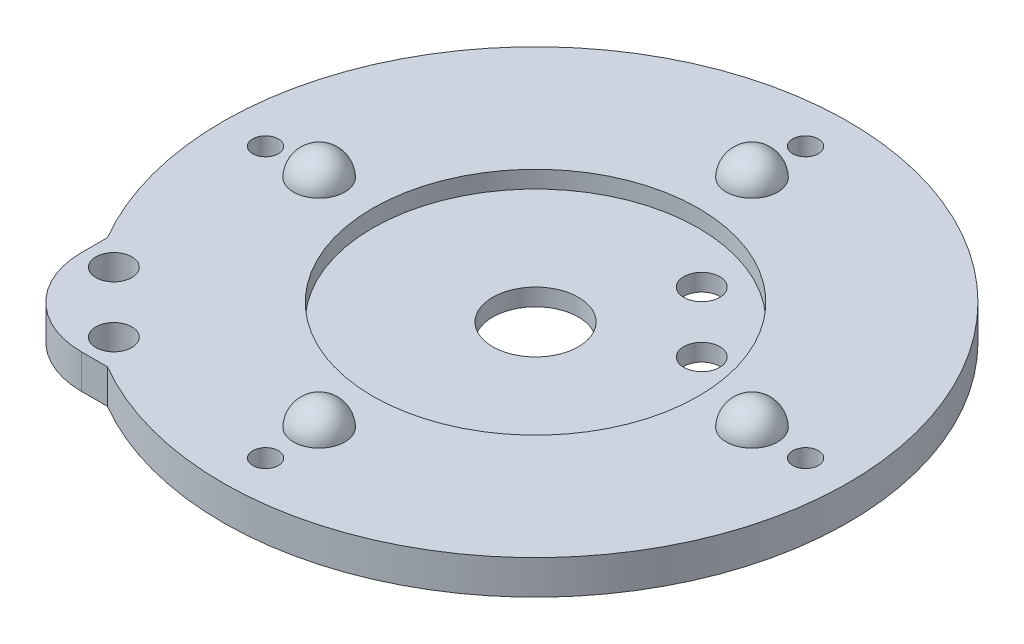
ISO-10303-21;
HEADER;
FILE_DESCRIPTION(('STEP AP214'),'2;1');
FILE_NAME('part.step','',(''),(''),'','','');
FILE_SCHEMA(('AUTOMOTIVE_DESIGN { 1 0 10303 214 1 1 1 1 }'));
ENDSEC;
DATA;
#1=APPLICATION_CONTEXT('core data for automotive mechanical design processes');
#2=APPLICATION_PROTOCOL_DEFINITION('international standard','automotive_design',2000,#1);
#3=PRODUCT_CONTEXT('',#1,'mechanical');
#4=PRODUCT('Part','Part','',(#3));
#5=PRODUCT_RELATED_PRODUCT_CATEGORY('part','',(#4));
#6=PRODUCT_DEFINITION_FORMATION('','',#4);
#7=PRODUCT_DEFINITION_CONTEXT('part definition',#1,'design');
#8=PRODUCT_DEFINITION('design','',#6,#7);
#9=PRODUCT_DEFINITION_SHAPE('','',#8);
#10=(LENGTH_UNIT() NAMED_UNIT(*) SI_UNIT(.MILLI.,.METRE.));
#11=(NAMED_UNIT(*) PLANE_ANGLE_UNIT() SI_UNIT($,.RADIAN.));
#12=(NAMED_UNIT(*) SI_UNIT($,.STERADIAN.) SOLID_ANGLE_UNIT());
#13=UNCERTAINTY_MEASURE_WITH_UNIT(LENGTH_MEASURE(1.E-05),#10,'distance_accuracy_value','');
#14=(GEOMETRIC_REPRESENTATION_CONTEXT(3) GLOBAL_UNCERTAINTY_ASSIGNED_CONTEXT((#13)) GLOBAL_UNIT_ASSIGNED_CONTEXT((#10,
#11,#12)) REPRESENTATION_CONTEXT('',''));
#15=CARTESIAN_POINT('',(0.,0.,0.));
#16=DIRECTION('',(0.,0.,1.));
#17=DIRECTION('',(1.,0.,0.));
#18=AXIS2_PLACEMENT_3D('',#15,#16,#17);
#19=CARTESIAN_POINT('',(0.,4.,31.5));
#20=DIRECTION('',(0.,0.,-1.));
#21=DIRECTION('',(-1.,0.,0.));
#22=AXIS2_PLACEMENT_3D('',#19,#20,#21);
#23=PLANE('',#22);
#24=DIRECTION('',(1.,0.,0.));
#25=VECTOR('',#24,1.);
#26=CARTESIAN_POINT('',(0.,4.,31.5));
#27=LINE('',#26,#25);
#28=CARTESIAN_POINT('',(-21.5,4.,31.5));
#29=VERTEX_POINT('',#28);
#30=CARTESIAN_POINT('',(-18.4390889145858,4.,31.5));
#31=VERTEX_POINT('',#30);
#32=EDGE_CURVE('E77',#29,#31,#27,.T.);
#33=ORIENTED_EDGE('',*,*,#32,.F.);
#34=DIRECTION('',(0.,-1.,0.));
#35=VECTOR('',#34,1.);
#36=CARTESIAN_POINT('',(-21.5,0.,31.5));
#37=LINE('',#36,#35);
#38=CARTESIAN_POINT('',(-21.5,0.,31.5));
#39=VERTEX_POINT('',#38);
#40=EDGE_CURVE('E105',#29,#39,#37,.T.);
#41=ORIENTED_EDGE('',*,*,#40,.T.);
#42=DIRECTION('',(1.,0.,0.));
#43=VECTOR('',#42,1.);
#44=CARTESIAN_POINT('',(0.,0.,31.5));
#45=LINE('',#44,#43);
#46=CARTESIAN_POINT('',(-18.4390889145858,0.,31.5));
#47=VERTEX_POINT('',#46);
#48=EDGE_CURVE('E100',#39,#47,#45,.T.);
#49=ORIENTED_EDGE('',*,*,#48,.T.);
#50=DIRECTION('',(0.,-1.,0.));
#51=VECTOR('',#50,1.);
#52=CARTESIAN_POINT('',(-18.4390889145858,4.,31.5));
#53=LINE('',#52,#51);
#54=EDGE_CURVE('E95',#31,#47,#53,.T.);
#55=ORIENTED_EDGE('',*,*,#54,.F.);
#56=EDGE_LOOP('',(#33,#41,#49,#55));
#57=FACE_BOUND('',#56,.T.);
#58=ADVANCED_FACE('F36',(#57),#23,.F.);
#59=CARTESIAN_POINT('',(0.,4.,0.));
#60=DIRECTION('',(0.,-1.,0.));
#61=DIRECTION('',(0.,0.,-1.));
#62=AXIS2_PLACEMENT_3D('',#59,#60,#61);
#63=CYLINDRICAL_SURFACE('',#62,36.5);
#64=CARTESIAN_POINT('',(0.,0.,0.));
#65=DIRECTION('',(0.,1.,0.));
#66=DIRECTION('',(0.,0.,1.));
#67=AXIS2_PLACEMENT_3D('',#64,#65,#66);
#68=CIRCLE('',#67,36.5);
#69=CARTESIAN_POINT('',(-31.5,0.,18.4390889145858));
#70=VERTEX_POINT('',#69);
#71=EDGE_CURVE('E196',#47,#70,#68,.T.);
#72=ORIENTED_EDGE('',*,*,#71,.T.);
#73=DIRECTION('',(0.,-1.,0.));
#74=VECTOR('',#73,1.);
#75=CARTESIAN_POINT('',(-31.5,4.,18.4390889145858));
#76=LINE('',#75,#74);
#77=CARTESIAN_POINT('',(-31.5,4.,18.4390889145858));
#78=VERTEX_POINT('',#77);
#79=EDGE_CURVE('E97',#78,#70,#76,.T.);
#80=ORIENTED_EDGE('',*,*,#79,.F.);
#81=CARTESIAN_POINT('',(0.,4.,0.));
#82=DIRECTION('',(0.,1.,0.));
#83=DIRECTION('',(0.,0.,1.));
#84=AXIS2_PLACEMENT_3D('',#81,#82,#83);
#85=CIRCLE('',#84,36.5);
#86=EDGE_CURVE('E81',#31,#78,#85,.T.);
#87=ORIENTED_EDGE('',*,*,#86,.F.);
#88=ORIENTED_EDGE('',*,*,#54,.T.);
#89=EDGE_LOOP('',(#72,#80,#87,#88));
#90=FACE_BOUND('',#89,.T.);
#91=ADVANCED_FACE('F94',(#90),#63,.T.);
#92=CARTESIAN_POINT('',(31.5,4.,0.));
#93=DIRECTION('',(0.,-1.,0.));
#94=DIRECTION('',(0.,0.,-1.));
#95=AXIS2_PLACEMENT_3D('',#92,#93,#94);
#96=CYLINDRICAL_SURFACE('',#95,1.5);
#97=CARTESIAN_POINT('',(31.5,4.,0.));
#98=DIRECTION('',(0.,1.,0.));
#99=DIRECTION('',(0.,0.,1.));
#100=AXIS2_PLACEMENT_3D('',#97,#98,#99);
#101=CIRCLE('',#100,1.5);
#102=CARTESIAN_POINT('',(31.5,4.,1.5));
#103=VERTEX_POINT('',#102);
#104=EDGE_CURVE('E177',#103,#103,#101,.T.);
#105=ORIENTED_EDGE('',*,*,#104,.T.);
#106=EDGE_LOOP('',(#105));
#107=FACE_BOUND('',#106,.T.);
#108=CARTESIAN_POINT('',(31.5,0.,0.));
#109=DIRECTION('',(0.,1.,0.));
#110=DIRECTION('',(0.,0.,1.));
#111=AXIS2_PLACEMENT_3D('',#108,#109,#110);
#112=CIRCLE('',#111,1.5);
#113=CARTESIAN_POINT('',(31.5,0.,1.5));
#114=VERTEX_POINT('',#113);
#115=EDGE_CURVE('E208',#114,#114,#112,.T.);
#116=ORIENTED_EDGE('',*,*,#115,.F.);
#117=EDGE_LOOP('',(#116));
#118=FACE_BOUND('',#117,.T.);
#119=ADVANCED_FACE('F143',(#107,#118),#96,.F.);
#120=CARTESIAN_POINT('',(-28.1357788234127,4.,21.0647110115472));
#121=DIRECTION('',(0.,-1.,0.));
#122=DIRECTION('',(0.,0.,-1.));
#123=AXIS2_PLACEMENT_3D('',#120,#121,#122);
#124=CYLINDRICAL_SURFACE('',#123,2.1);
#125=CARTESIAN_POINT('',(-28.1357788234127,4.,21.0647110115472));
#126=DIRECTION('',(0.,1.,0.));
#127=DIRECTION('',(0.,0.,1.));
#128=AXIS2_PLACEMENT_3D('',#125,#126,#127);
#129=CIRCLE('',#128,2.1);
#130=CARTESIAN_POINT('',(-28.1357788234127,4.,23.1647110115473));
#131=VERTEX_POINT('',#130);
#132=EDGE_CURVE('E182',#131,#131,#129,.T.);
#133=ORIENTED_EDGE('',*,*,#132,.T.);
#134=EDGE_LOOP('',(#133));
#135=FACE_BOUND('',#134,.T.);
#136=CARTESIAN_POINT('',(-28.1357788234127,0.,21.0647110115472));
#137=DIRECTION('',(0.,1.,0.));
#138=DIRECTION('',(0.,0.,1.));
#139=AXIS2_PLACEMENT_3D('',#136,#137,#138);
#140=CIRCLE('',#139,2.1);
#141=CARTESIAN_POINT('',(-28.1357788234127,0.,23.1647110115473));
#142=VERTEX_POINT('',#141);
#143=EDGE_CURVE('E206',#142,#142,#140,.T.);
#144=ORIENTED_EDGE('',*,*,#143,.F.);
#145=EDGE_LOOP('',(#144));
#146=FACE_BOUND('',#145,.T.);
#147=ADVANCED_FACE('F237',(#135,#146),#124,.F.);
#148=CARTESIAN_POINT('',(-31.5,4.,0.));
#149=DIRECTION('',(0.,-1.,0.));
#150=DIRECTION('',(0.,0.,-1.));
#151=AXIS2_PLACEMENT_3D('',#148,#149,#150);
#152=CYLINDRICAL_SURFACE('',#151,1.5);
#153=CARTESIAN_POINT('',(-31.5,4.,0.));
#154=DIRECTION('',(0.,1.,0.));
#155=DIRECTION('',(0.,0.,1.));
#156=AXIS2_PLACEMENT_3D('',#153,#154,#155);
#157=CIRCLE('',#156,1.5);
#158=CARTESIAN_POINT('',(-31.5,4.,1.5));
#159=VERTEX_POINT('',#158);
#160=EDGE_CURVE('E232',#159,#159,#157,.T.);
#161=ORIENTED_EDGE('',*,*,#160,.T.);
#162=EDGE_LOOP('',(#161));
#163=FACE_BOUND('',#162,.T.);
#164=CARTESIAN_POINT('',(-31.5,0.,0.));
#165=DIRECTION('',(0.,1.,0.));
#166=DIRECTION('',(0.,0.,1.));
#167=AXIS2_PLACEMENT_3D('',#164,#165,#166);
#168=CIRCLE('',#167,1.5);
#169=CARTESIAN_POINT('',(-31.5,0.,1.5));
#170=VERTEX_POINT('',#169);
#171=EDGE_CURVE('E203',#170,#170,#168,.T.);
#172=ORIENTED_EDGE('',*,*,#171,.F.);
#173=EDGE_LOOP('',(#172));
#174=FACE_BOUND('',#173,.T.);
#175=ADVANCED_FACE('F286',(#163,#174),#152,.F.);
#176=CARTESIAN_POINT('',(0.,4.,31.5));
#177=DIRECTION('',(0.,-1.,0.));
#178=DIRECTION('',(0.,0.,-1.));
#179=AXIS2_PLACEMENT_3D('',#176,#177,#178);
#180=CYLINDRICAL_SURFACE('',#179,1.5);
#181=CARTESIAN_POINT('',(0.,4.,31.5));
#182=DIRECTION('',(0.,1.,0.));
#183=DIRECTION('',(0.,0.,1.));
#184=AXIS2_PLACEMENT_3D('',#181,#182,#183);
#185=CIRCLE('',#184,1.5);
#186=CARTESIAN_POINT('',(0.,4.,33.));
#187=VERTEX_POINT('',#186);
#188=EDGE_CURVE('E229',#187,#187,#185,.T.);
#189=ORIENTED_EDGE('',*,*,#188,.T.);
#190=EDGE_LOOP('',(#189));
#191=FACE_BOUND('',#190,.T.);
#192=CARTESIAN_POINT('',(0.,0.,31.5));
#193=DIRECTION('',(0.,1.,0.));
#194=DIRECTION('',(0.,0.,1.));
#195=AXIS2_PLACEMENT_3D('',#192,#193,#194);
#196=CIRCLE('',#195,1.5);
#197=CARTESIAN_POINT('',(0.,0.,33.));
#198=VERTEX_POINT('',#197);
#199=EDGE_CURVE('E200',#198,#198,#196,.T.);
#200=ORIENTED_EDGE('',*,*,#199,.F.);
#201=EDGE_LOOP('',(#200));
#202=FACE_BOUND('',#201,.T.);
#203=ADVANCED_FACE('F289',(#191,#202),#180,.F.);
#204=CARTESIAN_POINT('',(0.,4.,0.));
#205=DIRECTION('',(0.,-1.,0.));
#206=DIRECTION('',(0.,0.,-1.));
#207=AXIS2_PLACEMENT_3D('',#204,#205,#206);
#208=CYLINDRICAL_SURFACE('',#207,19.);
#209=CARTESIAN_POINT('',(0.,2.,0.));
#210=DIRECTION('',(0.,1.,0.));
#211=DIRECTION('',(0.,0.,1.));
#212=AXIS2_PLACEMENT_3D('',#209,#210,#211);
#213=CIRCLE('',#212,19.);
#214=CARTESIAN_POINT('',(0.,2.,19.));
#215=VERTEX_POINT('',#214);
#216=EDGE_CURVE('E102',#215,#215,#213,.T.);
#217=ORIENTED_EDGE('',*,*,#216,.F.);
#218=EDGE_LOOP('',(#217));
#219=FACE_BOUND('',#218,.T.);
#220=CARTESIAN_POINT('',(0.,4.,0.));
#221=DIRECTION('',(0.,1.,0.));
#222=DIRECTION('',(0.,0.,1.));
#223=AXIS2_PLACEMENT_3D('',#220,#221,#222);
#224=CIRCLE('',#223,19.);
#225=CARTESIAN_POINT('',(0.,4.,19.));
#226=VERTEX_POINT('',#225);
#227=EDGE_CURVE('E226',#226,#226,#224,.T.);
#228=ORIENTED_EDGE('',*,*,#227,.T.);
#229=EDGE_LOOP('',(#228));
#230=FACE_BOUND('',#229,.T.);
#231=ADVANCED_FACE('F293',(#219,#230),#208,.F.);
#232=CARTESIAN_POINT('',(-31.5,4.,0.));
#233=DIRECTION('',(-1.,0.,0.));
#234=DIRECTION('',(0.,0.,1.));
#235=AXIS2_PLACEMENT_3D('',#232,#233,#234);
#236=PLANE('',#235);
#237=DIRECTION('',(0.,0.,-1.));
#238=VECTOR('',#237,1.);
#239=CARTESIAN_POINT('',(-31.5,0.,0.));
#240=LINE('',#239,#238);
#241=CARTESIAN_POINT('',(-31.5,0.,21.5));
#242=VERTEX_POINT('',#241);
#243=EDGE_CURVE('E198',#242,#70,#240,.T.);
#244=ORIENTED_EDGE('',*,*,#243,.F.);
#245=DIRECTION('',(0.,-1.,0.));
#246=VECTOR('',#245,1.);
#247=CARTESIAN_POINT('',(-31.5,4.,21.5));
#248=LINE('',#247,#246);
#249=CARTESIAN_POINT('',(-31.5,4.,21.5));
#250=VERTEX_POINT('',#249);
#251=EDGE_CURVE('E51',#242,#250,#248,.F.);
#252=ORIENTED_EDGE('',*,*,#251,.T.);
#253=DIRECTION('',(0.,0.,-1.));
#254=VECTOR('',#253,1.);
#255=CARTESIAN_POINT('',(-31.5,4.,0.));
#256=LINE('',#255,#254);
#257=EDGE_CURVE('E98',#250,#78,#256,.T.);
#258=ORIENTED_EDGE('',*,*,#257,.T.);
#259=ORIENTED_EDGE('',*,*,#79,.T.);
#260=EDGE_LOOP('',(#244,#252,#258,#259));
#261=FACE_BOUND('',#260,.T.);
#262=ADVANCED_FACE('F151',(#261),#236,.T.);
#263=CARTESIAN_POINT('',(0.,4.,-31.5));
#264=DIRECTION('',(0.,-1.,0.));
#265=DIRECTION('',(0.,0.,-1.));
#266=AXIS2_PLACEMENT_3D('',#263,#264,#265);
#267=CYLINDRICAL_SURFACE('',#266,1.5);
#268=CARTESIAN_POINT('',(0.,4.,-31.5));
#269=DIRECTION('',(0.,1.,0.));
#270=DIRECTION('',(0.,0.,1.));
#271=AXIS2_PLACEMENT_3D('',#268,#269,#270);
#272=CIRCLE('',#271,1.5);
#273=CARTESIAN_POINT('',(0.,4.,-30.));
#274=VERTEX_POINT('',#273);
#275=EDGE_CURVE('E89',#274,#274,#272,.T.);
#276=ORIENTED_EDGE('',*,*,#275,.T.);
#277=EDGE_LOOP('',(#276));
#278=FACE_BOUND('',#277,.T.);
#279=CARTESIAN_POINT('',(0.,0.,-31.5));
#280=DIRECTION('',(0.,1.,0.));
#281=DIRECTION('',(0.,0.,1.));
#282=AXIS2_PLACEMENT_3D('',#279,#280,#281);
#283=CIRCLE('',#282,1.5);
#284=CARTESIAN_POINT('',(0.,0.,-30.));
#285=VERTEX_POINT('',#284);
#286=EDGE_CURVE('E191',#285,#285,#283,.T.);
#287=ORIENTED_EDGE('',*,*,#286,.F.);
#288=EDGE_LOOP('',(#287));
#289=FACE_BOUND('',#288,.T.);
#290=ADVANCED_FACE('F147',(#278,#289),#267,.F.);
#291=CARTESIAN_POINT('',(-21.0647110115472,4.,28.1357788234127));
#292=DIRECTION('',(0.,-1.,0.));
#293=DIRECTION('',(0.,0.,-1.));
#294=AXIS2_PLACEMENT_3D('',#291,#292,#293);
#295=CYLINDRICAL_SURFACE('',#294,2.1);
#296=CARTESIAN_POINT('',(-21.0647110115472,4.,28.1357788234127));
#297=DIRECTION('',(0.,1.,0.));
#298=DIRECTION('',(0.,0.,1.));
#299=AXIS2_PLACEMENT_3D('',#296,#297,#298);
#300=CIRCLE('',#299,2.1);
#301=CARTESIAN_POINT('',(-21.0647110115472,4.,30.2357788234127));
#302=VERTEX_POINT('',#301);
#303=EDGE_CURVE('E210',#302,#302,#300,.F.);
#304=ORIENTED_EDGE('',*,*,#303,.F.);
#305=EDGE_LOOP('',(#304));
#306=FACE_BOUND('',#305,.T.);
#307=CARTESIAN_POINT('',(-21.0647110115472,0.,28.1357788234127));
#308=DIRECTION('',(0.,1.,0.));
#309=DIRECTION('',(0.,0.,1.));
#310=AXIS2_PLACEMENT_3D('',#307,#308,#309);
#311=CIRCLE('',#310,2.1);
#312=CARTESIAN_POINT('',(-21.0647110115472,0.,30.2357788234127));
#313=VERTEX_POINT('',#312);
#314=EDGE_CURVE('E188',#313,#313,#311,.F.);
#315=ORIENTED_EDGE('',*,*,#314,.T.);
#316=EDGE_LOOP('',(#315));
#317=FACE_BOUND('',#316,.T.);
#318=ADVANCED_FACE('F150',(#306,#317),#295,.F.);
#319=CARTESIAN_POINT('',(0.,4.,0.));
#320=DIRECTION('',(0.,1.,0.));
#321=DIRECTION('',(0.,0.,1.));
#322=AXIS2_PLACEMENT_3D('',#319,#320,#321);
#323=PLANE('',#322);
#324=ORIENTED_EDGE('',*,*,#303,.T.);
#325=EDGE_LOOP('',(#324));
#326=FACE_BOUND('',#325,.T.);
#327=CARTESIAN_POINT('',(0.,4.,-25.25));
#328=DIRECTION('',(0.,1.,0.));
#329=DIRECTION('',(0.,0.,1.));
#330=AXIS2_PLACEMENT_3D('',#327,#328,#329);
#331=CIRCLE('',#330,3.);
#332=CARTESIAN_POINT('',(0.,4.,-22.25));
#333=VERTEX_POINT('',#332);
#334=EDGE_CURVE('E214',#333,#333,#331,.T.);
#335=ORIENTED_EDGE('',*,*,#334,.F.);
#336=EDGE_LOOP('',(#335));
#337=FACE_BOUND('',#336,.T.);
#338=ORIENTED_EDGE('',*,*,#275,.F.);
#339=EDGE_LOOP('',(#338));
#340=FACE_BOUND('',#339,.T.);
#341=ORIENTED_EDGE('',*,*,#257,.F.);
#342=CARTESIAN_POINT('',(-21.5,4.,21.5));
#343=DIRECTION('',(0.,1.,0.));
#344=DIRECTION('',(0.,0.,1.));
#345=AXIS2_PLACEMENT_3D('',#342,#343,#344);
#346=CIRCLE('',#345,10.);
#347=EDGE_CURVE('E84',#250,#29,#346,.T.);
#348=ORIENTED_EDGE('',*,*,#347,.T.);
#349=ORIENTED_EDGE('',*,*,#32,.T.);
#350=ORIENTED_EDGE('',*,*,#86,.T.);
#351=EDGE_LOOP('',(#341,#348,#349,#350));
#352=FACE_BOUND('',#351,.T.);
#353=ORIENTED_EDGE('',*,*,#227,.F.);
#354=EDGE_LOOP('',(#353));
#355=FACE_BOUND('',#354,.T.);
#356=ORIENTED_EDGE('',*,*,#188,.F.);
#357=EDGE_LOOP('',(#356));
#358=FACE_BOUND('',#357,.T.);
#359=ORIENTED_EDGE('',*,*,#160,.F.);
#360=EDGE_LOOP('',(#359));
#361=FACE_BOUND('',#360,.T.);
#362=ORIENTED_EDGE('',*,*,#132,.F.);
#363=EDGE_LOOP('',(#362));
#364=FACE_BOUND('',#363,.T.);
#365=ORIENTED_EDGE('',*,*,#104,.F.);
#366=EDGE_LOOP('',(#365));
#367=FACE_BOUND('',#366,.T.);
#368=CARTESIAN_POINT('',(1.42911185989971E-12,4.,25.25));
#369=DIRECTION('',(0.,1.,0.));
#370=DIRECTION('',(0.,0.,1.));
#371=AXIS2_PLACEMENT_3D('',#368,#369,#370);
#372=CIRCLE('',#371,3.00000000000153);
#373=CARTESIAN_POINT('',(1.42911185989971E-12,4.,28.2500000000015));
#374=VERTEX_POINT('',#373);
#375=EDGE_CURVE('E173',#374,#374,#372,.T.);
#376=ORIENTED_EDGE('',*,*,#375,.F.);
#377=EDGE_LOOP('',(#376));
#378=FACE_BOUND('',#377,.T.);
#379=CARTESIAN_POINT('',(25.2500000000007,4.,-7.14555929949854E-13));
#380=DIRECTION('',(0.,1.,0.));
#381=DIRECTION('',(0.,0.,1.));
#382=AXIS2_PLACEMENT_3D('',#379,#380,#381);
#383=CIRCLE('',#382,3.00000000000056);
#384=CARTESIAN_POINT('',(25.2500000000007,4.,2.99999999999985));
#385=VERTEX_POINT('',#384);
#386=EDGE_CURVE('E176',#385,#385,#383,.T.);
#387=ORIENTED_EDGE('',*,*,#386,.F.);
#388=EDGE_LOOP('',(#387));
#389=FACE_BOUND('',#388,.T.);
#390=CARTESIAN_POINT('',(-25.2499999999993,4.,7.17648163117701E-13));
#391=DIRECTION('',(0.,1.,0.));
#392=DIRECTION('',(0.,0.,1.));
#393=AXIS2_PLACEMENT_3D('',#390,#391,#392);
#394=CIRCLE('',#393,3.00000000000115);
#395=CARTESIAN_POINT('',(-25.2499999999993,4.,3.00000000000187));
#396=VERTEX_POINT('',#395);
#397=EDGE_CURVE('E107',#396,#396,#394,.T.);
#398=ORIENTED_EDGE('',*,*,#397,.F.);
#399=EDGE_LOOP('',(#398));
#400=FACE_BOUND('',#399,.T.);
#401=ADVANCED_FACE('F79',(#326,#337,#340,#352,#355,#358,#361,#364,#367,#378,#389,#400),#323,.T.);
#402=CARTESIAN_POINT('',(0.,0.,0.));
#403=DIRECTION('',(0.,1.,0.));
#404=DIRECTION('',(0.,0.,1.));
#405=AXIS2_PLACEMENT_3D('',#402,#403,#404);
#406=PLANE('',#405);
#407=ORIENTED_EDGE('',*,*,#314,.F.);
#408=EDGE_LOOP('',(#407));
#409=FACE_BOUND('',#408,.T.);
#410=ORIENTED_EDGE('',*,*,#286,.T.);
#411=EDGE_LOOP('',(#410));
#412=FACE_BOUND('',#411,.T.);
#413=ORIENTED_EDGE('',*,*,#48,.F.);
#414=CARTESIAN_POINT('',(-21.5,0.,21.5));
#415=DIRECTION('',(0.,1.,0.));
#416=DIRECTION('',(0.,0.,1.));
#417=AXIS2_PLACEMENT_3D('',#414,#415,#416);
#418=CIRCLE('',#417,10.);
#419=EDGE_CURVE('E59',#39,#242,#418,.F.);
#420=ORIENTED_EDGE('',*,*,#419,.T.);
#421=ORIENTED_EDGE('',*,*,#243,.T.);
#422=ORIENTED_EDGE('',*,*,#71,.F.);
#423=EDGE_LOOP('',(#413,#420,#421,#422));
#424=FACE_BOUND('',#423,.T.);
#425=ORIENTED_EDGE('',*,*,#199,.T.);
#426=EDGE_LOOP('',(#425));
#427=FACE_BOUND('',#426,.T.);
#428=ORIENTED_EDGE('',*,*,#171,.T.);
#429=EDGE_LOOP('',(#428));
#430=FACE_BOUND('',#429,.T.);
#431=ORIENTED_EDGE('',*,*,#143,.T.);
#432=EDGE_LOOP('',(#431));
#433=FACE_BOUND('',#432,.T.);
#434=ORIENTED_EDGE('',*,*,#115,.T.);
#435=EDGE_LOOP('',(#434));
#436=FACE_BOUND('',#435,.T.);
#437=CARTESIAN_POINT('',(13.2299678760003,0.,-6.15890006413483));
#438=DIRECTION('',(0.,1.,0.));
#439=DIRECTION('',(0.,0.,1.));
#440=AXIS2_PLACEMENT_3D('',#437,#438,#439);
#441=CIRCLE('',#440,2.1);
#442=CARTESIAN_POINT('',(13.2299678760003,0.,-4.05890006413483));
#443=VERTEX_POINT('',#442);
#444=EDGE_CURVE('E310',#443,#443,#441,.F.);
#445=ORIENTED_EDGE('',*,*,#444,.F.);
#446=EDGE_LOOP('',(#445));
#447=FACE_BOUND('',#446,.T.);
#448=CARTESIAN_POINT('',(6.15890006413483,0.,-13.2299678760003));
#449=DIRECTION('',(0.,1.,0.));
#450=DIRECTION('',(0.,0.,1.));
#451=AXIS2_PLACEMENT_3D('',#448,#449,#450);
#452=CIRCLE('',#451,2.1);
#453=CARTESIAN_POINT('',(6.15890006413483,0.,-11.1299678760003));
#454=VERTEX_POINT('',#453);
#455=EDGE_CURVE('E314',#454,#454,#452,.T.);
#456=ORIENTED_EDGE('',*,*,#455,.T.);
#457=EDGE_LOOP('',(#456));
#458=FACE_BOUND('',#457,.T.);
#459=CARTESIAN_POINT('',(0.,0.,0.));
#460=DIRECTION('',(0.,1.,0.));
#461=DIRECTION('',(0.,0.,1.));
#462=AXIS2_PLACEMENT_3D('',#459,#460,#461);
#463=CIRCLE('',#462,5.);
#464=CARTESIAN_POINT('',(0.,0.,5.));
#465=VERTEX_POINT('',#464);
#466=EDGE_CURVE('E220',#465,#465,#463,.T.);
#467=ORIENTED_EDGE('',*,*,#466,.T.);
#468=EDGE_LOOP('',(#467));
#469=FACE_BOUND('',#468,.T.);
#470=ADVANCED_FACE('F242',(#409,#412,#424,#427,#430,#433,#436,#447,#458,#469),#406,.F.);
#471=CARTESIAN_POINT('',(6.15890006413483,2.,-13.2299678760003));
#472=DIRECTION('',(0.,-1.,0.));
#473=DIRECTION('',(0.,0.,-1.));
#474=AXIS2_PLACEMENT_3D('',#471,#472,#473);
#475=CYLINDRICAL_SURFACE('',#474,2.1);
#476=CARTESIAN_POINT('',(6.15890006413483,2.,-13.2299678760003));
#477=DIRECTION('',(0.,1.,0.));
#478=DIRECTION('',(0.,0.,1.));
#479=AXIS2_PLACEMENT_3D('',#476,#477,#478);
#480=CIRCLE('',#479,2.1);
#481=CARTESIAN_POINT('',(6.15890006413483,2.,-11.1299678760003));
#482=VERTEX_POINT('',#481);
#483=EDGE_CURVE('E320',#482,#482,#480,.T.);
#484=ORIENTED_EDGE('',*,*,#483,.T.);
#485=EDGE_LOOP('',(#484));
#486=FACE_BOUND('',#485,.T.);
#487=ORIENTED_EDGE('',*,*,#455,.F.);
#488=EDGE_LOOP('',(#487));
#489=FACE_BOUND('',#488,.T.);
#490=ADVANCED_FACE('F271',(#486,#489),#475,.F.);
#491=CARTESIAN_POINT('',(13.2299678760003,2.,-6.15890006413483));
#492=DIRECTION('',(0.,-1.,0.));
#493=DIRECTION('',(0.,0.,-1.));
#494=AXIS2_PLACEMENT_3D('',#491,#492,#493);
#495=CYLINDRICAL_SURFACE('',#494,2.1);
#496=CARTESIAN_POINT('',(13.2299678760003,2.,-6.15890006413483));
#497=DIRECTION('',(0.,1.,0.));
#498=DIRECTION('',(0.,0.,1.));
#499=AXIS2_PLACEMENT_3D('',#496,#497,#498);
#500=CIRCLE('',#499,2.1);
#501=CARTESIAN_POINT('',(13.2299678760003,2.,-4.05890006413483));
#502=VERTEX_POINT('',#501);
#503=EDGE_CURVE('E318',#502,#502,#500,.F.);
#504=ORIENTED_EDGE('',*,*,#503,.F.);
#505=EDGE_LOOP('',(#504));
#506=FACE_BOUND('',#505,.T.);
#507=ORIENTED_EDGE('',*,*,#444,.T.);
#508=EDGE_LOOP('',(#507));
#509=FACE_BOUND('',#508,.T.);
#510=ADVANCED_FACE('F269',(#506,#509),#495,.F.);
#511=CARTESIAN_POINT('',(0.,2.,0.));
#512=DIRECTION('',(0.,-1.,0.));
#513=DIRECTION('',(0.,0.,-1.));
#514=AXIS2_PLACEMENT_3D('',#511,#512,#513);
#515=CYLINDRICAL_SURFACE('',#514,5.);
#516=CARTESIAN_POINT('',(0.,2.,0.));
#517=DIRECTION('',(0.,1.,0.));
#518=DIRECTION('',(0.,0.,1.));
#519=AXIS2_PLACEMENT_3D('',#516,#517,#518);
#520=CIRCLE('',#519,5.);
#521=CARTESIAN_POINT('',(0.,2.,5.));
#522=VERTEX_POINT('',#521);
#523=EDGE_CURVE('E192',#522,#522,#520,.T.);
#524=ORIENTED_EDGE('',*,*,#523,.T.);
#525=EDGE_LOOP('',(#524));
#526=FACE_BOUND('',#525,.T.);
#527=ORIENTED_EDGE('',*,*,#466,.F.);
#528=EDGE_LOOP('',(#527));
#529=FACE_BOUND('',#528,.T.);
#530=ADVANCED_FACE('F265',(#526,#529),#515,.F.);
#531=CARTESIAN_POINT('',(0.,2.,0.));
#532=DIRECTION('',(0.,1.,0.));
#533=DIRECTION('',(0.,0.,1.));
#534=AXIS2_PLACEMENT_3D('',#531,#532,#533);
#535=PLANE('',#534);
#536=ORIENTED_EDGE('',*,*,#503,.T.);
#537=EDGE_LOOP('',(#536));
#538=FACE_BOUND('',#537,.T.);
#539=ORIENTED_EDGE('',*,*,#216,.T.);
#540=EDGE_LOOP('',(#539));
#541=FACE_BOUND('',#540,.T.);
#542=ORIENTED_EDGE('',*,*,#483,.F.);
#543=EDGE_LOOP('',(#542));
#544=FACE_BOUND('',#543,.T.);
#545=ORIENTED_EDGE('',*,*,#523,.F.);
#546=EDGE_LOOP('',(#545));
#547=FACE_BOUND('',#546,.T.);
#548=ADVANCED_FACE('F159',(#538,#541,#544,#547),#535,.T.);
#549=CARTESIAN_POINT('',(-21.5,4.,21.5));
#550=DIRECTION('',(0.,1.,0.));
#551=DIRECTION('',(0.,0.,1.));
#552=AXIS2_PLACEMENT_3D('',#549,#550,#551);
#553=CYLINDRICAL_SURFACE('',#552,10.);
#554=ORIENTED_EDGE('',*,*,#347,.F.);
#555=ORIENTED_EDGE('',*,*,#251,.F.);
#556=ORIENTED_EDGE('',*,*,#419,.F.);
#557=ORIENTED_EDGE('',*,*,#40,.F.);
#558=EDGE_LOOP('',(#554,#555,#556,#557));
#559=FACE_BOUND('',#558,.T.);
#560=ADVANCED_FACE('F156',(#559),#553,.T.);
#561=CARTESIAN_POINT('',(0.,6.9,0.));
#562=DIRECTION('',(0.,1.,0.));
#563=DIRECTION('',(0.,0.,1.));
#564=AXIS2_PLACEMENT_3D('',#561,#562,#563);
#565=PLANE('',#564);
#566=CARTESIAN_POINT('',(0.,6.9,-25.25));
#567=DIRECTION('',(0.,1.,0.));
#568=DIRECTION('',(0.,0.,1.));
#569=AXIS2_PLACEMENT_3D('',#566,#567,#568);
#570=CIRCLE('',#569,0.0016671298870099);
#571=CARTESIAN_POINT('',(0.,6.9,-25.248332870113));
#572=VERTEX_POINT('',#571);
#573=EDGE_CURVE('E44',#572,#572,#570,.T.);
#574=ORIENTED_EDGE('',*,*,#573,.T.);
#575=EDGE_LOOP('',(#574));
#576=FACE_BOUND('',#575,.T.);
#577=ADVANCED_FACE('F123',(#576),#565,.T.);
#578=CARTESIAN_POINT('',(0.,6.9,0.));
#579=DIRECTION('',(0.,1.,0.));
#580=DIRECTION('',(0.,0.,1.));
#581=AXIS2_PLACEMENT_3D('',#578,#579,#580);
#582=PLANE('',#581);
#583=CARTESIAN_POINT('',(-25.2499999999993,6.9,7.17648163117701E-13));
#584=DIRECTION('',(0.,1.,0.));
#585=DIRECTION('',(0.,0.,1.));
#586=AXIS2_PLACEMENT_3D('',#583,#584,#585);
#587=CIRCLE('',#586,0.00166712988815742);
#588=CARTESIAN_POINT('',(-25.2499999999993,6.9,0.00166712988887507));
#589=VERTEX_POINT('',#588);
#590=EDGE_CURVE('E11',#589,#589,#587,.T.);
#591=ORIENTED_EDGE('',*,*,#590,.T.);
#592=EDGE_LOOP('',(#591));
#593=FACE_BOUND('',#592,.T.);
#594=ADVANCED_FACE('F252',(#593),#582,.T.);
#595=CARTESIAN_POINT('',(0.,6.9,0.));
#596=DIRECTION('',(0.,1.,0.));
#597=DIRECTION('',(0.,0.,1.));
#598=AXIS2_PLACEMENT_3D('',#595,#596,#597);
#599=PLANE('',#598);
#600=CARTESIAN_POINT('',(25.2500000000007,6.9,-7.14555929949854E-13));
#601=DIRECTION('',(0.,1.,0.));
#602=DIRECTION('',(0.,0.,1.));
#603=AXIS2_PLACEMENT_3D('',#600,#601,#602);
#604=CIRCLE('',#603,0.00166712988757022);
#605=CARTESIAN_POINT('',(25.2500000000007,6.9,0.00166712988685566));
#606=VERTEX_POINT('',#605);
#607=EDGE_CURVE('E118',#606,#606,#604,.T.);
#608=ORIENTED_EDGE('',*,*,#607,.T.);
#609=EDGE_LOOP('',(#608));
#610=FACE_BOUND('',#609,.T.);
#611=ADVANCED_FACE('F167',(#610),#599,.T.);
#612=CARTESIAN_POINT('',(0.,6.9,0.));
#613=DIRECTION('',(0.,1.,0.));
#614=DIRECTION('',(0.,0.,1.));
#615=AXIS2_PLACEMENT_3D('',#612,#613,#614);
#616=PLANE('',#615);
#617=CARTESIAN_POINT('',(1.42911185989971E-12,6.9,25.25));
#618=DIRECTION('',(0.,1.,0.));
#619=DIRECTION('',(0.,0.,1.));
#620=AXIS2_PLACEMENT_3D('',#617,#618,#619);
#621=CIRCLE('',#620,0.00166712988854513);
#622=CARTESIAN_POINT('',(1.42911185989971E-12,6.9,25.2516671298885));
#623=VERTEX_POINT('',#622);
#624=EDGE_CURVE('E115',#623,#623,#621,.T.);
#625=ORIENTED_EDGE('',*,*,#624,.T.);
#626=EDGE_LOOP('',(#625));
#627=FACE_BOUND('',#626,.T.);
#628=ADVANCED_FACE('F162',(#627),#616,.T.);
#629=CARTESIAN_POINT('',(1.42911185989971E-12,3.9,25.25));
#630=DIRECTION('',(0.,-1.,0.));
#631=DIRECTION('',(0.,0.,-1.));
#632=AXIS2_PLACEMENT_3D('',#629,#630,#631);
#633=DEGENERATE_TOROIDAL_SURFACE('',#632,0.00166712988854513,3.,.T.);
#634=ORIENTED_EDGE('',*,*,#375,.T.);
#635=EDGE_LOOP('',(#634));
#636=FACE_BOUND('',#635,.T.);
#637=ORIENTED_EDGE('',*,*,#624,.F.);
#638=EDGE_LOOP('',(#637));
#639=FACE_BOUND('',#638,.T.);
#640=ADVANCED_FACE('F134',(#636,#639),#633,.T.);
#641=CARTESIAN_POINT('',(25.2500000000007,3.9,-7.14555929949854E-13));
#642=DIRECTION('',(0.,-1.,0.));
#643=DIRECTION('',(0.,0.,-1.));
#644=AXIS2_PLACEMENT_3D('',#641,#642,#643);
#645=DEGENERATE_TOROIDAL_SURFACE('',#644,0.00166712988757022,3.,.T.);
#646=ORIENTED_EDGE('',*,*,#386,.T.);
#647=EDGE_LOOP('',(#646));
#648=FACE_BOUND('',#647,.T.);
#649=ORIENTED_EDGE('',*,*,#607,.F.);
#650=EDGE_LOOP('',(#649));
#651=FACE_BOUND('',#650,.T.);
#652=ADVANCED_FACE('F127',(#648,#651),#645,.T.);
#653=CARTESIAN_POINT('',(0.,3.9,-25.25));
#654=DIRECTION('',(0.,-1.,0.));
#655=DIRECTION('',(0.,0.,-1.));
#656=AXIS2_PLACEMENT_3D('',#653,#654,#655);
#657=DEGENERATE_TOROIDAL_SURFACE('',#656,0.0016671298870099,3.,.T.);
#658=ORIENTED_EDGE('',*,*,#334,.T.);
#659=EDGE_LOOP('',(#658));
#660=FACE_BOUND('',#659,.T.);
#661=ORIENTED_EDGE('',*,*,#573,.F.);
#662=EDGE_LOOP('',(#661));
#663=FACE_BOUND('',#662,.T.);
#664=ADVANCED_FACE('F125',(#660,#663),#657,.T.);
#665=CARTESIAN_POINT('',(-25.2499999999993,3.9,7.17648163117701E-13));
#666=DIRECTION('',(0.,-1.,0.));
#667=DIRECTION('',(0.,0.,-1.));
#668=AXIS2_PLACEMENT_3D('',#665,#666,#667);
#669=DEGENERATE_TOROIDAL_SURFACE('',#668,0.00166712988815742,3.,.T.);
#670=ORIENTED_EDGE('',*,*,#397,.T.);
#671=EDGE_LOOP('',(#670));
#672=FACE_BOUND('',#671,.T.);
#673=ORIENTED_EDGE('',*,*,#590,.F.);
#674=EDGE_LOOP('',(#673));
#675=FACE_BOUND('',#674,.T.);
#676=ADVANCED_FACE('F38',(#672,#675),#669,.T.);
#677=CLOSED_SHELL('',(#58,#91,#119,#147,#175,#203,#231,#262,#290,#318,#401,#470,#490,#510,#530,
#548,#560,#577,#594,#611,#628,#640,#652,#664,#676));
#678=MANIFOLD_SOLID_BREP('B2',#677);
#679=ADVANCED_BREP_SHAPE_REPRESENTATION('',(#18,#678),#14);
#680=SHAPE_DEFINITION_REPRESENTATION(#9,#679);
ENDSEC;
END-ISO-10303-21;
